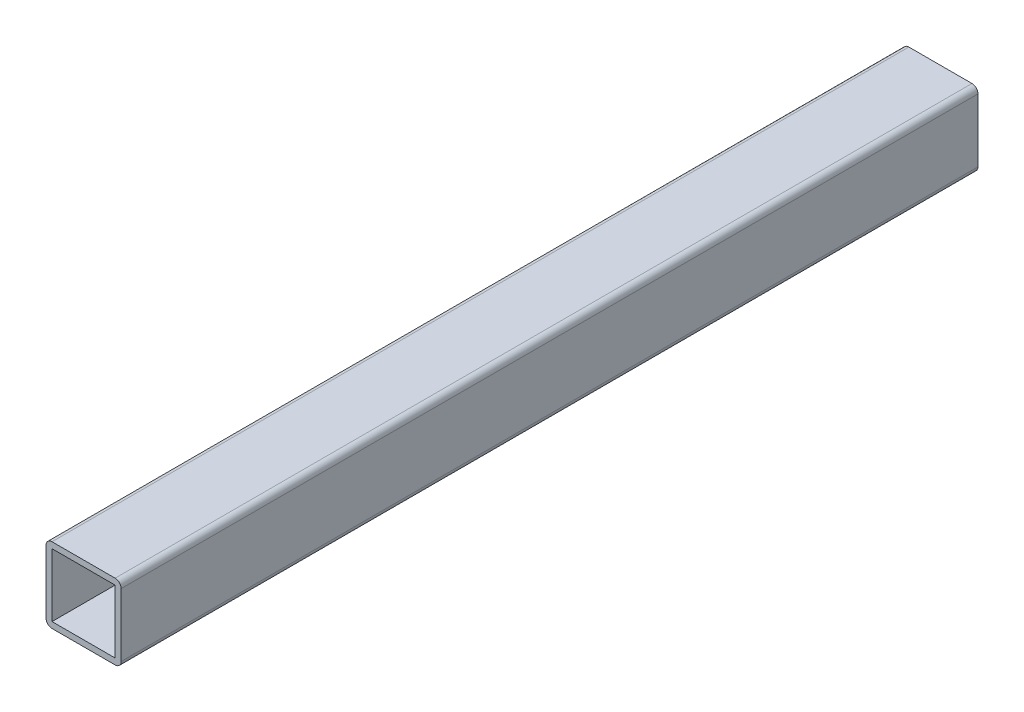
ISO-10303-21;
HEADER;
FILE_DESCRIPTION(('STEP AP214'),'2;1');
FILE_NAME('part.step','',(''),(''),'','','');
FILE_SCHEMA(('AUTOMOTIVE_DESIGN { 1 0 10303 214 1 1 1 1 }'));
ENDSEC;
DATA;
#1=APPLICATION_CONTEXT('core data for automotive mechanical design processes');
#2=APPLICATION_PROTOCOL_DEFINITION('international standard','automotive_design',2000,#1);
#3=PRODUCT_CONTEXT('',#1,'mechanical');
#4=PRODUCT('Part','Part','',(#3));
#5=PRODUCT_RELATED_PRODUCT_CATEGORY('part','',(#4));
#6=PRODUCT_DEFINITION_FORMATION('','',#4);
#7=PRODUCT_DEFINITION_CONTEXT('part definition',#1,'design');
#8=PRODUCT_DEFINITION('design','',#6,#7);
#9=PRODUCT_DEFINITION_SHAPE('','',#8);
#10=(LENGTH_UNIT() NAMED_UNIT(*) SI_UNIT(.MILLI.,.METRE.));
#11=(NAMED_UNIT(*) PLANE_ANGLE_UNIT() SI_UNIT($,.RADIAN.));
#12=(NAMED_UNIT(*) SI_UNIT($,.STERADIAN.) SOLID_ANGLE_UNIT());
#13=UNCERTAINTY_MEASURE_WITH_UNIT(LENGTH_MEASURE(1.E-05),#10,'distance_accuracy_value','');
#14=(GEOMETRIC_REPRESENTATION_CONTEXT(3) GLOBAL_UNCERTAINTY_ASSIGNED_CONTEXT((#13)) GLOBAL_UNIT_ASSIGNED_CONTEXT((#10,
#11,#12)) REPRESENTATION_CONTEXT('',''));
#15=CARTESIAN_POINT('',(0.,0.,0.));
#16=DIRECTION('',(0.,0.,1.));
#17=DIRECTION('',(1.,0.,0.));
#18=AXIS2_PLACEMENT_3D('',#15,#16,#17);
#19=CARTESIAN_POINT('',(4.,46.,570.));
#20=DIRECTION('',(0.,0.,-1.));
#21=DIRECTION('',(-1.,0.,0.));
#22=AXIS2_PLACEMENT_3D('',#19,#20,#21);
#23=PLANE('',#22);
#24=CARTESIAN_POINT('',(4.,46.,570.));
#25=DIRECTION('',(0.,0.,1.));
#26=DIRECTION('',(-1.,0.,0.));
#27=AXIS2_PLACEMENT_3D('',#24,#25,#26);
#28=CIRCLE('',#27,4.);
#29=CARTESIAN_POINT('',(4.,50.,570.));
#30=VERTEX_POINT('',#29);
#31=CARTESIAN_POINT('',(0.,46.,570.));
#32=VERTEX_POINT('',#31);
#33=EDGE_CURVE('E159',#30,#32,#28,.T.);
#34=ORIENTED_EDGE('',*,*,#33,.T.);
#35=DIRECTION('',(0.,-1.,0.));
#36=VECTOR('',#35,1.);
#37=CARTESIAN_POINT('',(0.,4.00000000000003,570.));
#38=LINE('',#37,#36);
#39=CARTESIAN_POINT('',(0.,4.00000000000003,570.));
#40=VERTEX_POINT('',#39);
#41=EDGE_CURVE('E162',#32,#40,#38,.T.);
#42=ORIENTED_EDGE('',*,*,#41,.T.);
#43=CARTESIAN_POINT('',(4.,4.,570.));
#44=DIRECTION('',(0.,0.,1.));
#45=DIRECTION('',(-1.,0.,0.));
#46=AXIS2_PLACEMENT_3D('',#43,#44,#45);
#47=CIRCLE('',#46,4.);
#48=CARTESIAN_POINT('',(4.00000000000003,0.,570.));
#49=VERTEX_POINT('',#48);
#50=EDGE_CURVE('E165',#40,#49,#47,.T.);
#51=ORIENTED_EDGE('',*,*,#50,.T.);
#52=DIRECTION('',(1.,0.,0.));
#53=VECTOR('',#52,1.);
#54=CARTESIAN_POINT('',(4.00000000000003,0.,570.));
#55=LINE('',#54,#53);
#56=CARTESIAN_POINT('',(46.,0.,570.));
#57=VERTEX_POINT('',#56);
#58=EDGE_CURVE('E167',#49,#57,#55,.T.);
#59=ORIENTED_EDGE('',*,*,#58,.T.);
#60=CARTESIAN_POINT('',(46.,4.,570.));
#61=DIRECTION('',(0.,0.,1.));
#62=DIRECTION('',(1.,0.,0.));
#63=AXIS2_PLACEMENT_3D('',#60,#61,#62);
#64=CIRCLE('',#63,4.);
#65=CARTESIAN_POINT('',(50.,4.,570.));
#66=VERTEX_POINT('',#65);
#67=EDGE_CURVE('E169',#57,#66,#64,.T.);
#68=ORIENTED_EDGE('',*,*,#67,.T.);
#69=DIRECTION('',(0.,1.,0.));
#70=VECTOR('',#69,1.);
#71=CARTESIAN_POINT('',(50.,4.,570.));
#72=LINE('',#71,#70);
#73=CARTESIAN_POINT('',(50.,46.,570.));
#74=VERTEX_POINT('',#73);
#75=EDGE_CURVE('E171',#66,#74,#72,.T.);
#76=ORIENTED_EDGE('',*,*,#75,.T.);
#77=CARTESIAN_POINT('',(46.,46.,570.));
#78=DIRECTION('',(0.,0.,1.));
#79=DIRECTION('',(1.,0.,0.));
#80=AXIS2_PLACEMENT_3D('',#77,#78,#79);
#81=CIRCLE('',#80,4.);
#82=CARTESIAN_POINT('',(46.,50.,570.));
#83=VERTEX_POINT('',#82);
#84=EDGE_CURVE('E173',#74,#83,#81,.T.);
#85=ORIENTED_EDGE('',*,*,#84,.T.);
#86=DIRECTION('',(-1.,0.,0.));
#87=VECTOR('',#86,1.);
#88=CARTESIAN_POINT('',(4.,50.,570.));
#89=LINE('',#88,#87);
#90=EDGE_CURVE('E175',#83,#30,#89,.T.);
#91=ORIENTED_EDGE('',*,*,#90,.T.);
#92=EDGE_LOOP('',(#34,#42,#51,#59,#68,#76,#85,#91));
#93=FACE_BOUND('',#92,.T.);
#94=DIRECTION('',(0.,-1.,0.));
#95=VECTOR('',#94,1.);
#96=CARTESIAN_POINT('',(4.,46.,570.));
#97=LINE('',#96,#95);
#98=CARTESIAN_POINT('',(4.,46.,570.));
#99=VERTEX_POINT('',#98);
#100=CARTESIAN_POINT('',(4.00000000000001,4.,570.));
#101=VERTEX_POINT('',#100);
#102=EDGE_CURVE('E123',#99,#101,#97,.T.);
#103=ORIENTED_EDGE('',*,*,#102,.F.);
#104=DIRECTION('',(-1.,0.,0.));
#105=VECTOR('',#104,1.);
#106=CARTESIAN_POINT('',(4.,46.,570.));
#107=LINE('',#106,#105);
#108=CARTESIAN_POINT('',(46.,46.,570.));
#109=VERTEX_POINT('',#108);
#110=EDGE_CURVE('E145',#109,#99,#107,.T.);
#111=ORIENTED_EDGE('',*,*,#110,.F.);
#112=DIRECTION('',(0.,1.,0.));
#113=VECTOR('',#112,1.);
#114=CARTESIAN_POINT('',(46.,46.,570.));
#115=LINE('',#114,#113);
#116=CARTESIAN_POINT('',(46.,4.,570.));
#117=VERTEX_POINT('',#116);
#118=EDGE_CURVE('E143',#117,#109,#115,.T.);
#119=ORIENTED_EDGE('',*,*,#118,.F.);
#120=DIRECTION('',(1.,0.,0.));
#121=VECTOR('',#120,1.);
#122=CARTESIAN_POINT('',(4.00000000000001,4.,570.));
#123=LINE('',#122,#121);
#124=EDGE_CURVE('E131',#101,#117,#123,.T.);
#125=ORIENTED_EDGE('',*,*,#124,.F.);
#126=EDGE_LOOP('',(#103,#111,#119,#125));
#127=FACE_BOUND('',#126,.T.);
#128=ADVANCED_FACE('F34',(#93,#127),#23,.F.);
#129=CARTESIAN_POINT('',(4.,46.,0.));
#130=DIRECTION('',(0.,0.,-1.));
#131=DIRECTION('',(-1.,0.,0.));
#132=AXIS2_PLACEMENT_3D('',#129,#130,#131);
#133=PLANE('',#132);
#134=CARTESIAN_POINT('',(4.,46.,0.));
#135=DIRECTION('',(0.,0.,1.));
#136=DIRECTION('',(-1.,0.,0.));
#137=AXIS2_PLACEMENT_3D('',#134,#135,#136);
#138=CIRCLE('',#137,4.);
#139=CARTESIAN_POINT('',(4.,50.,0.));
#140=VERTEX_POINT('',#139);
#141=CARTESIAN_POINT('',(0.,46.,0.));
#142=VERTEX_POINT('',#141);
#143=EDGE_CURVE('E139',#140,#142,#138,.T.);
#144=ORIENTED_EDGE('',*,*,#143,.F.);
#145=DIRECTION('',(-1.,0.,0.));
#146=VECTOR('',#145,1.);
#147=CARTESIAN_POINT('',(4.,50.,0.));
#148=LINE('',#147,#146);
#149=CARTESIAN_POINT('',(46.,50.,0.));
#150=VERTEX_POINT('',#149);
#151=EDGE_CURVE('E163',#150,#140,#148,.T.);
#152=ORIENTED_EDGE('',*,*,#151,.F.);
#153=CARTESIAN_POINT('',(46.,46.,0.));
#154=DIRECTION('',(0.,0.,1.));
#155=DIRECTION('',(1.,0.,0.));
#156=AXIS2_PLACEMENT_3D('',#153,#154,#155);
#157=CIRCLE('',#156,4.);
#158=CARTESIAN_POINT('',(50.,46.,0.));
#159=VERTEX_POINT('',#158);
#160=EDGE_CURVE('E190',#159,#150,#157,.T.);
#161=ORIENTED_EDGE('',*,*,#160,.F.);
#162=DIRECTION('',(0.,1.,0.));
#163=VECTOR('',#162,1.);
#164=CARTESIAN_POINT('',(50.,4.,0.));
#165=LINE('',#164,#163);
#166=CARTESIAN_POINT('',(50.,4.,0.));
#167=VERTEX_POINT('',#166);
#168=EDGE_CURVE('E188',#167,#159,#165,.T.);
#169=ORIENTED_EDGE('',*,*,#168,.F.);
#170=CARTESIAN_POINT('',(46.,4.,0.));
#171=DIRECTION('',(0.,0.,1.));
#172=DIRECTION('',(1.,0.,0.));
#173=AXIS2_PLACEMENT_3D('',#170,#171,#172);
#174=CIRCLE('',#173,4.);
#175=CARTESIAN_POINT('',(46.,0.,0.));
#176=VERTEX_POINT('',#175);
#177=EDGE_CURVE('E186',#176,#167,#174,.T.);
#178=ORIENTED_EDGE('',*,*,#177,.F.);
#179=DIRECTION('',(1.,0.,0.));
#180=VECTOR('',#179,1.);
#181=CARTESIAN_POINT('',(4.00000000000003,0.,0.));
#182=LINE('',#181,#180);
#183=CARTESIAN_POINT('',(4.00000000000003,0.,0.));
#184=VERTEX_POINT('',#183);
#185=EDGE_CURVE('E184',#184,#176,#182,.T.);
#186=ORIENTED_EDGE('',*,*,#185,.F.);
#187=CARTESIAN_POINT('',(4.,4.,0.));
#188=DIRECTION('',(0.,0.,1.));
#189=DIRECTION('',(-1.,0.,0.));
#190=AXIS2_PLACEMENT_3D('',#187,#188,#189);
#191=CIRCLE('',#190,4.);
#192=CARTESIAN_POINT('',(0.,4.00000000000003,0.));
#193=VERTEX_POINT('',#192);
#194=EDGE_CURVE('E182',#193,#184,#191,.T.);
#195=ORIENTED_EDGE('',*,*,#194,.F.);
#196=DIRECTION('',(0.,-1.,0.));
#197=VECTOR('',#196,1.);
#198=CARTESIAN_POINT('',(0.,4.00000000000003,0.));
#199=LINE('',#198,#197);
#200=EDGE_CURVE('E180',#142,#193,#199,.T.);
#201=ORIENTED_EDGE('',*,*,#200,.F.);
#202=EDGE_LOOP('',(#144,#152,#161,#169,#178,#186,#195,#201));
#203=FACE_BOUND('',#202,.T.);
#204=DIRECTION('',(-1.,0.,0.));
#205=VECTOR('',#204,1.);
#206=CARTESIAN_POINT('',(4.,46.,0.));
#207=LINE('',#206,#205);
#208=CARTESIAN_POINT('',(46.,46.,0.));
#209=VERTEX_POINT('',#208);
#210=CARTESIAN_POINT('',(4.,46.,0.));
#211=VERTEX_POINT('',#210);
#212=EDGE_CURVE('E132',#209,#211,#207,.T.);
#213=ORIENTED_EDGE('',*,*,#212,.T.);
#214=DIRECTION('',(0.,-1.,0.));
#215=VECTOR('',#214,1.);
#216=CARTESIAN_POINT('',(4.,46.,0.));
#217=LINE('',#216,#215);
#218=CARTESIAN_POINT('',(4.00000000000001,4.,0.));
#219=VERTEX_POINT('',#218);
#220=EDGE_CURVE('E57',#211,#219,#217,.T.);
#221=ORIENTED_EDGE('',*,*,#220,.T.);
#222=DIRECTION('',(1.,0.,0.));
#223=VECTOR('',#222,1.);
#224=CARTESIAN_POINT('',(4.00000000000001,4.,0.));
#225=LINE('',#224,#223);
#226=CARTESIAN_POINT('',(46.,4.,0.));
#227=VERTEX_POINT('',#226);
#228=EDGE_CURVE('E138',#219,#227,#225,.T.);
#229=ORIENTED_EDGE('',*,*,#228,.T.);
#230=DIRECTION('',(0.,1.,0.));
#231=VECTOR('',#230,1.);
#232=CARTESIAN_POINT('',(46.,46.,0.));
#233=LINE('',#232,#231);
#234=EDGE_CURVE('E151',#227,#209,#233,.T.);
#235=ORIENTED_EDGE('',*,*,#234,.T.);
#236=EDGE_LOOP('',(#213,#221,#229,#235));
#237=FACE_BOUND('',#236,.T.);
#238=ADVANCED_FACE('F220',(#203,#237),#133,.T.);
#239=CARTESIAN_POINT('',(4.,46.,570.));
#240=DIRECTION('',(0.,0.,-1.));
#241=DIRECTION('',(-1.,0.,0.));
#242=AXIS2_PLACEMENT_3D('',#239,#240,#241);
#243=CYLINDRICAL_SURFACE('',#242,4.);
#244=ORIENTED_EDGE('',*,*,#143,.T.);
#245=DIRECTION('',(0.,0.,-1.));
#246=VECTOR('',#245,1.);
#247=CARTESIAN_POINT('',(0.,46.,570.));
#248=LINE('',#247,#246);
#249=EDGE_CURVE('E11',#32,#142,#248,.T.);
#250=ORIENTED_EDGE('',*,*,#249,.F.);
#251=ORIENTED_EDGE('',*,*,#33,.F.);
#252=DIRECTION('',(0.,0.,-1.));
#253=VECTOR('',#252,1.);
#254=CARTESIAN_POINT('',(4.,50.,570.));
#255=LINE('',#254,#253);
#256=EDGE_CURVE('E177',#30,#140,#255,.T.);
#257=ORIENTED_EDGE('',*,*,#256,.T.);
#258=EDGE_LOOP('',(#244,#250,#251,#257));
#259=FACE_BOUND('',#258,.T.);
#260=ADVANCED_FACE('F36',(#259),#243,.T.);
#261=CARTESIAN_POINT('',(0.,4.00000000000003,570.));
#262=DIRECTION('',(1.,0.,0.));
#263=DIRECTION('',(0.,0.,-1.));
#264=AXIS2_PLACEMENT_3D('',#261,#262,#263);
#265=PLANE('',#264);
#266=ORIENTED_EDGE('',*,*,#200,.T.);
#267=DIRECTION('',(0.,0.,-1.));
#268=VECTOR('',#267,1.);
#269=CARTESIAN_POINT('',(0.,4.00000000000003,570.));
#270=LINE('',#269,#268);
#271=EDGE_CURVE('E42',#40,#193,#270,.T.);
#272=ORIENTED_EDGE('',*,*,#271,.F.);
#273=ORIENTED_EDGE('',*,*,#41,.F.);
#274=ORIENTED_EDGE('',*,*,#249,.T.);
#275=EDGE_LOOP('',(#266,#272,#273,#274));
#276=FACE_BOUND('',#275,.T.);
#277=ADVANCED_FACE('F237',(#276),#265,.F.);
#278=CARTESIAN_POINT('',(4.,4.,570.));
#279=DIRECTION('',(0.,0.,-1.));
#280=DIRECTION('',(-1.,0.,0.));
#281=AXIS2_PLACEMENT_3D('',#278,#279,#280);
#282=CYLINDRICAL_SURFACE('',#281,4.);
#283=ORIENTED_EDGE('',*,*,#194,.T.);
#284=DIRECTION('',(0.,0.,-1.));
#285=VECTOR('',#284,1.);
#286=CARTESIAN_POINT('',(4.00000000000003,0.,570.));
#287=LINE('',#286,#285);
#288=EDGE_CURVE('E207',#49,#184,#287,.T.);
#289=ORIENTED_EDGE('',*,*,#288,.F.);
#290=ORIENTED_EDGE('',*,*,#50,.F.);
#291=ORIENTED_EDGE('',*,*,#271,.T.);
#292=EDGE_LOOP('',(#283,#289,#290,#291));
#293=FACE_BOUND('',#292,.T.);
#294=ADVANCED_FACE('F214',(#293),#282,.T.);
#295=CARTESIAN_POINT('',(4.00000000000003,0.,570.));
#296=DIRECTION('',(0.,1.,0.));
#297=DIRECTION('',(0.,0.,1.));
#298=AXIS2_PLACEMENT_3D('',#295,#296,#297);
#299=PLANE('',#298);
#300=ORIENTED_EDGE('',*,*,#185,.T.);
#301=DIRECTION('',(0.,0.,-1.));
#302=VECTOR('',#301,1.);
#303=CARTESIAN_POINT('',(46.,0.,570.));
#304=LINE('',#303,#302);
#305=EDGE_CURVE('E204',#57,#176,#304,.T.);
#306=ORIENTED_EDGE('',*,*,#305,.F.);
#307=ORIENTED_EDGE('',*,*,#58,.F.);
#308=ORIENTED_EDGE('',*,*,#288,.T.);
#309=EDGE_LOOP('',(#300,#306,#307,#308));
#310=FACE_BOUND('',#309,.T.);
#311=ADVANCED_FACE('F226',(#310),#299,.F.);
#312=CARTESIAN_POINT('',(46.,4.,570.));
#313=DIRECTION('',(0.,0.,-1.));
#314=DIRECTION('',(-1.,0.,0.));
#315=AXIS2_PLACEMENT_3D('',#312,#313,#314);
#316=CYLINDRICAL_SURFACE('',#315,4.);
#317=ORIENTED_EDGE('',*,*,#177,.T.);
#318=DIRECTION('',(0.,0.,-1.));
#319=VECTOR('',#318,1.);
#320=CARTESIAN_POINT('',(50.,4.,570.));
#321=LINE('',#320,#319);
#322=EDGE_CURVE('E201',#66,#167,#321,.T.);
#323=ORIENTED_EDGE('',*,*,#322,.F.);
#324=ORIENTED_EDGE('',*,*,#67,.F.);
#325=ORIENTED_EDGE('',*,*,#305,.T.);
#326=EDGE_LOOP('',(#317,#323,#324,#325));
#327=FACE_BOUND('',#326,.T.);
#328=ADVANCED_FACE('F230',(#327),#316,.T.);
#329=CARTESIAN_POINT('',(50.,4.,570.));
#330=DIRECTION('',(-1.,0.,0.));
#331=DIRECTION('',(0.,0.,1.));
#332=AXIS2_PLACEMENT_3D('',#329,#330,#331);
#333=PLANE('',#332);
#334=ORIENTED_EDGE('',*,*,#168,.T.);
#335=DIRECTION('',(0.,0.,-1.));
#336=VECTOR('',#335,1.);
#337=CARTESIAN_POINT('',(50.,46.,570.));
#338=LINE('',#337,#336);
#339=EDGE_CURVE('E198',#74,#159,#338,.T.);
#340=ORIENTED_EDGE('',*,*,#339,.F.);
#341=ORIENTED_EDGE('',*,*,#75,.F.);
#342=ORIENTED_EDGE('',*,*,#322,.T.);
#343=EDGE_LOOP('',(#334,#340,#341,#342));
#344=FACE_BOUND('',#343,.T.);
#345=ADVANCED_FACE('F250',(#344),#333,.F.);
#346=CARTESIAN_POINT('',(46.,46.,570.));
#347=DIRECTION('',(0.,0.,-1.));
#348=DIRECTION('',(-1.,0.,0.));
#349=AXIS2_PLACEMENT_3D('',#346,#347,#348);
#350=CYLINDRICAL_SURFACE('',#349,4.);
#351=ORIENTED_EDGE('',*,*,#160,.T.);
#352=DIRECTION('',(0.,0.,-1.));
#353=VECTOR('',#352,1.);
#354=CARTESIAN_POINT('',(46.,50.,570.));
#355=LINE('',#354,#353);
#356=EDGE_CURVE('E195',#83,#150,#355,.T.);
#357=ORIENTED_EDGE('',*,*,#356,.F.);
#358=ORIENTED_EDGE('',*,*,#84,.F.);
#359=ORIENTED_EDGE('',*,*,#339,.T.);
#360=EDGE_LOOP('',(#351,#357,#358,#359));
#361=FACE_BOUND('',#360,.T.);
#362=ADVANCED_FACE('F248',(#361),#350,.T.);
#363=CARTESIAN_POINT('',(4.,50.,570.));
#364=DIRECTION('',(0.,-1.,0.));
#365=DIRECTION('',(0.,0.,-1.));
#366=AXIS2_PLACEMENT_3D('',#363,#364,#365);
#367=PLANE('',#366);
#368=ORIENTED_EDGE('',*,*,#151,.T.);
#369=ORIENTED_EDGE('',*,*,#256,.F.);
#370=ORIENTED_EDGE('',*,*,#90,.F.);
#371=ORIENTED_EDGE('',*,*,#356,.T.);
#372=EDGE_LOOP('',(#368,#369,#370,#371));
#373=FACE_BOUND('',#372,.T.);
#374=ADVANCED_FACE('F243',(#373),#367,.F.);
#375=CARTESIAN_POINT('',(4.,46.,570.));
#376=DIRECTION('',(1.,0.,0.));
#377=DIRECTION('',(0.,1.,0.));
#378=AXIS2_PLACEMENT_3D('',#375,#376,#377);
#379=PLANE('',#378);
#380=ORIENTED_EDGE('',*,*,#220,.F.);
#381=DIRECTION('',(0.,0.,-1.));
#382=VECTOR('',#381,1.);
#383=CARTESIAN_POINT('',(4.,46.,570.));
#384=LINE('',#383,#382);
#385=EDGE_CURVE('E127',#99,#211,#384,.T.);
#386=ORIENTED_EDGE('',*,*,#385,.F.);
#387=ORIENTED_EDGE('',*,*,#102,.T.);
#388=DIRECTION('',(0.,0.,-1.));
#389=VECTOR('',#388,1.);
#390=CARTESIAN_POINT('',(4.00000000000001,4.,570.));
#391=LINE('',#390,#389);
#392=EDGE_CURVE('E126',#101,#219,#391,.T.);
#393=ORIENTED_EDGE('',*,*,#392,.T.);
#394=EDGE_LOOP('',(#380,#386,#387,#393));
#395=FACE_BOUND('',#394,.T.);
#396=ADVANCED_FACE('F125',(#395),#379,.T.);
#397=CARTESIAN_POINT('',(4.00000000000001,4.,570.));
#398=DIRECTION('',(0.,1.,0.));
#399=DIRECTION('',(0.,0.,1.));
#400=AXIS2_PLACEMENT_3D('',#397,#398,#399);
#401=PLANE('',#400);
#402=ORIENTED_EDGE('',*,*,#228,.F.);
#403=ORIENTED_EDGE('',*,*,#392,.F.);
#404=ORIENTED_EDGE('',*,*,#124,.T.);
#405=DIRECTION('',(0.,0.,-1.));
#406=VECTOR('',#405,1.);
#407=CARTESIAN_POINT('',(46.,4.,570.));
#408=LINE('',#407,#406);
#409=EDGE_CURVE('E140',#117,#227,#408,.T.);
#410=ORIENTED_EDGE('',*,*,#409,.T.);
#411=EDGE_LOOP('',(#402,#403,#404,#410));
#412=FACE_BOUND('',#411,.T.);
#413=ADVANCED_FACE('F135',(#412),#401,.T.);
#414=CARTESIAN_POINT('',(46.,46.,570.));
#415=DIRECTION('',(-1.,0.,0.));
#416=DIRECTION('',(0.,-1.,0.));
#417=AXIS2_PLACEMENT_3D('',#414,#415,#416);
#418=PLANE('',#417);
#419=ORIENTED_EDGE('',*,*,#234,.F.);
#420=ORIENTED_EDGE('',*,*,#409,.F.);
#421=ORIENTED_EDGE('',*,*,#118,.T.);
#422=DIRECTION('',(0.,0.,-1.));
#423=VECTOR('',#422,1.);
#424=CARTESIAN_POINT('',(46.,46.,570.));
#425=LINE('',#424,#423);
#426=EDGE_CURVE('E49',#109,#209,#425,.T.);
#427=ORIENTED_EDGE('',*,*,#426,.T.);
#428=EDGE_LOOP('',(#419,#420,#421,#427));
#429=FACE_BOUND('',#428,.T.);
#430=ADVANCED_FACE('F275',(#429),#418,.T.);
#431=CARTESIAN_POINT('',(4.,46.,570.));
#432=DIRECTION('',(0.,-1.,0.));
#433=DIRECTION('',(0.,0.,-1.));
#434=AXIS2_PLACEMENT_3D('',#431,#432,#433);
#435=PLANE('',#434);
#436=ORIENTED_EDGE('',*,*,#212,.F.);
#437=ORIENTED_EDGE('',*,*,#426,.F.);
#438=ORIENTED_EDGE('',*,*,#110,.T.);
#439=ORIENTED_EDGE('',*,*,#385,.T.);
#440=EDGE_LOOP('',(#436,#437,#438,#439));
#441=FACE_BOUND('',#440,.T.);
#442=ADVANCED_FACE('F279',(#441),#435,.T.);
#443=CLOSED_SHELL('',(#128,#238,#260,#277,#294,#311,#328,#345,#362,#374,#396,#413,#430,#442));
#444=MANIFOLD_SOLID_BREP('B2',#443);
#445=ADVANCED_BREP_SHAPE_REPRESENTATION('',(#18,#444),#14);
#446=SHAPE_DEFINITION_REPRESENTATION(#9,#445);
ENDSEC;
END-ISO-10303-21;
